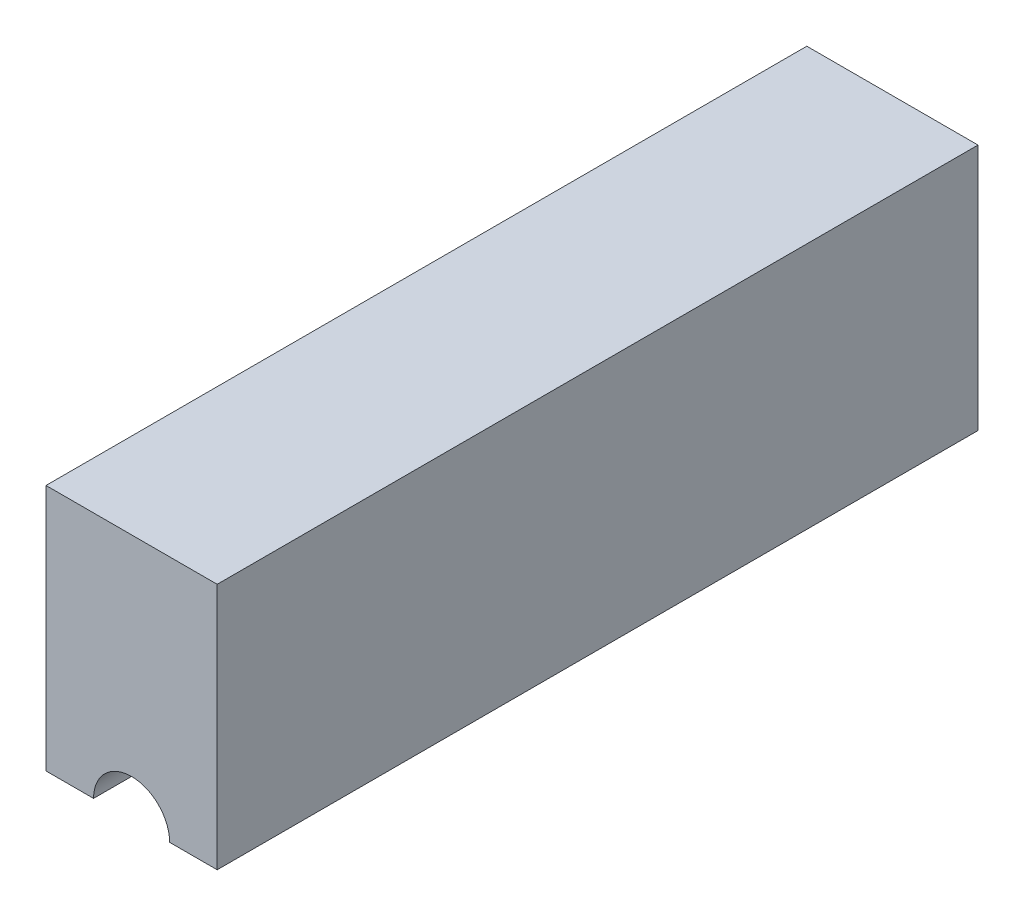
ISO-10303-21;
HEADER;
FILE_DESCRIPTION(('STEP AP214'),'2;1');
FILE_NAME('part.step','',(''),(''),'','','');
FILE_SCHEMA(('AUTOMOTIVE_DESIGN { 1 0 10303 214 1 1 1 1 }'));
ENDSEC;
DATA;
#1=APPLICATION_CONTEXT('core data for automotive mechanical design processes');
#2=APPLICATION_PROTOCOL_DEFINITION('international standard','automotive_design',2000,#1);
#3=PRODUCT_CONTEXT('',#1,'mechanical');
#4=PRODUCT('Part','Part','',(#3));
#5=PRODUCT_RELATED_PRODUCT_CATEGORY('part','',(#4));
#6=PRODUCT_DEFINITION_FORMATION('','',#4);
#7=PRODUCT_DEFINITION_CONTEXT('part definition',#1,'design');
#8=PRODUCT_DEFINITION('design','',#6,#7);
#9=PRODUCT_DEFINITION_SHAPE('','',#8);
#10=(LENGTH_UNIT() NAMED_UNIT(*) SI_UNIT(.MILLI.,.METRE.));
#11=(NAMED_UNIT(*) PLANE_ANGLE_UNIT() SI_UNIT($,.RADIAN.));
#12=(NAMED_UNIT(*) SI_UNIT($,.STERADIAN.) SOLID_ANGLE_UNIT());
#13=UNCERTAINTY_MEASURE_WITH_UNIT(LENGTH_MEASURE(1.E-05),#10,'distance_accuracy_value','');
#14=(GEOMETRIC_REPRESENTATION_CONTEXT(3) GLOBAL_UNCERTAINTY_ASSIGNED_CONTEXT((#13)) GLOBAL_UNIT_ASSIGNED_CONTEXT((#10,
#11,#12)) REPRESENTATION_CONTEXT('',''));
#15=CARTESIAN_POINT('',(0.,0.,0.));
#16=DIRECTION('',(0.,0.,1.));
#17=DIRECTION('',(1.,0.,0.));
#18=AXIS2_PLACEMENT_3D('',#15,#16,#17);
#19=CARTESIAN_POINT('',(0.,0.,100.));
#20=DIRECTION('',(1.,0.,0.));
#21=DIRECTION('',(0.,0.,-1.));
#22=AXIS2_PLACEMENT_3D('',#19,#20,#21);
#23=PLANE('',#22);
#24=DIRECTION('',(0.,-1.,0.));
#25=VECTOR('',#24,1.);
#26=CARTESIAN_POINT('',(0.,0.,-100.));
#27=LINE('',#26,#25);
#28=CARTESIAN_POINT('',(0.,65.,-100.));
#29=VERTEX_POINT('',#28);
#30=CARTESIAN_POINT('',(0.,0.,-100.));
#31=VERTEX_POINT('',#30);
#32=EDGE_CURVE('E94',#29,#31,#27,.T.);
#33=ORIENTED_EDGE('',*,*,#32,.T.);
#34=DIRECTION('',(0.,0.,-1.));
#35=VECTOR('',#34,1.);
#36=CARTESIAN_POINT('',(0.,0.,100.));
#37=LINE('',#36,#35);
#38=CARTESIAN_POINT('',(0.,0.,100.));
#39=VERTEX_POINT('',#38);
#40=EDGE_CURVE('E11',#39,#31,#37,.T.);
#41=ORIENTED_EDGE('',*,*,#40,.F.);
#42=DIRECTION('',(0.,-1.,0.));
#43=VECTOR('',#42,1.);
#44=CARTESIAN_POINT('',(0.,0.,100.));
#45=LINE('',#44,#43);
#46=CARTESIAN_POINT('',(0.,65.,100.));
#47=VERTEX_POINT('',#46);
#48=EDGE_CURVE('E117',#47,#39,#45,.T.);
#49=ORIENTED_EDGE('',*,*,#48,.F.);
#50=DIRECTION('',(0.,0.,-1.));
#51=VECTOR('',#50,1.);
#52=CARTESIAN_POINT('',(0.,65.,100.));
#53=LINE('',#52,#51);
#54=EDGE_CURVE('E107',#47,#29,#53,.T.);
#55=ORIENTED_EDGE('',*,*,#54,.T.);
#56=EDGE_LOOP('',(#33,#41,#49,#55));
#57=FACE_BOUND('',#56,.T.);
#58=ADVANCED_FACE('F38',(#57),#23,.F.);
#59=CARTESIAN_POINT('',(0.,0.,100.));
#60=DIRECTION('',(0.,1.,0.));
#61=DIRECTION('',(0.,0.,1.));
#62=AXIS2_PLACEMENT_3D('',#59,#60,#61);
#63=PLANE('',#62);
#64=DIRECTION('',(1.,0.,0.));
#65=VECTOR('',#64,1.);
#66=CARTESIAN_POINT('',(0.,0.,-100.));
#67=LINE('',#66,#65);
#68=CARTESIAN_POINT('',(12.5,0.,-100.));
#69=VERTEX_POINT('',#68);
#70=EDGE_CURVE('E90',#31,#69,#67,.T.);
#71=ORIENTED_EDGE('',*,*,#70,.T.);
#72=DIRECTION('',(0.,0.,-1.));
#73=VECTOR('',#72,1.);
#74=CARTESIAN_POINT('',(12.5,0.,100.));
#75=LINE('',#74,#73);
#76=CARTESIAN_POINT('',(12.5,0.,100.));
#77=VERTEX_POINT('',#76);
#78=EDGE_CURVE('E45',#77,#69,#75,.T.);
#79=ORIENTED_EDGE('',*,*,#78,.F.);
#80=DIRECTION('',(1.,0.,0.));
#81=VECTOR('',#80,1.);
#82=CARTESIAN_POINT('',(0.,0.,100.));
#83=LINE('',#82,#81);
#84=EDGE_CURVE('E103',#39,#77,#83,.T.);
#85=ORIENTED_EDGE('',*,*,#84,.F.);
#86=ORIENTED_EDGE('',*,*,#40,.T.);
#87=EDGE_LOOP('',(#71,#79,#85,#86));
#88=FACE_BOUND('',#87,.T.);
#89=ADVANCED_FACE('F102',(#88),#63,.F.);
#90=CARTESIAN_POINT('',(22.5,0.,100.));
#91=DIRECTION('',(0.,0.,-1.));
#92=DIRECTION('',(-1.,0.,0.));
#93=AXIS2_PLACEMENT_3D('',#90,#91,#92);
#94=CYLINDRICAL_SURFACE('',#93,10.);
#95=CARTESIAN_POINT('',(22.5,0.,-100.));
#96=DIRECTION('',(0.,0.,-1.));
#97=DIRECTION('',(1.,0.,0.));
#98=AXIS2_PLACEMENT_3D('',#95,#96,#97);
#99=CIRCLE('',#98,10.);
#100=CARTESIAN_POINT('',(32.5,0.,-100.));
#101=VERTEX_POINT('',#100);
#102=EDGE_CURVE('E96',#69,#101,#99,.T.);
#103=ORIENTED_EDGE('',*,*,#102,.T.);
#104=DIRECTION('',(0.,0.,-1.));
#105=VECTOR('',#104,1.);
#106=CARTESIAN_POINT('',(32.5,0.,100.));
#107=LINE('',#106,#105);
#108=CARTESIAN_POINT('',(32.5,0.,100.));
#109=VERTEX_POINT('',#108);
#110=EDGE_CURVE('E133',#109,#101,#107,.T.);
#111=ORIENTED_EDGE('',*,*,#110,.F.);
#112=CARTESIAN_POINT('',(22.5,0.,100.));
#113=DIRECTION('',(0.,0.,-1.));
#114=DIRECTION('',(1.,0.,0.));
#115=AXIS2_PLACEMENT_3D('',#112,#113,#114);
#116=CIRCLE('',#115,10.);
#117=EDGE_CURVE('E120',#77,#109,#116,.T.);
#118=ORIENTED_EDGE('',*,*,#117,.F.);
#119=ORIENTED_EDGE('',*,*,#78,.T.);
#120=EDGE_LOOP('',(#103,#111,#118,#119));
#121=FACE_BOUND('',#120,.T.);
#122=ADVANCED_FACE('F137',(#121),#94,.F.);
#123=CARTESIAN_POINT('',(32.5,0.,100.));
#124=DIRECTION('',(0.,1.,0.));
#125=DIRECTION('',(0.,0.,1.));
#126=AXIS2_PLACEMENT_3D('',#123,#124,#125);
#127=PLANE('',#126);
#128=DIRECTION('',(1.,0.,0.));
#129=VECTOR('',#128,1.);
#130=CARTESIAN_POINT('',(32.5,0.,-100.));
#131=LINE('',#130,#129);
#132=CARTESIAN_POINT('',(45.,0.,-100.));
#133=VERTEX_POINT('',#132);
#134=EDGE_CURVE('E111',#101,#133,#131,.T.);
#135=ORIENTED_EDGE('',*,*,#134,.T.);
#136=DIRECTION('',(0.,0.,-1.));
#137=VECTOR('',#136,1.);
#138=CARTESIAN_POINT('',(45.,0.,100.));
#139=LINE('',#138,#137);
#140=CARTESIAN_POINT('',(45.,0.,100.));
#141=VERTEX_POINT('',#140);
#142=EDGE_CURVE('E130',#141,#133,#139,.T.);
#143=ORIENTED_EDGE('',*,*,#142,.F.);
#144=DIRECTION('',(1.,0.,0.));
#145=VECTOR('',#144,1.);
#146=CARTESIAN_POINT('',(32.5,0.,100.));
#147=LINE('',#146,#145);
#148=EDGE_CURVE('E122',#109,#141,#147,.T.);
#149=ORIENTED_EDGE('',*,*,#148,.F.);
#150=ORIENTED_EDGE('',*,*,#110,.T.);
#151=EDGE_LOOP('',(#135,#143,#149,#150));
#152=FACE_BOUND('',#151,.T.);
#153=ADVANCED_FACE('F143',(#152),#127,.F.);
#154=CARTESIAN_POINT('',(45.,0.,100.));
#155=DIRECTION('',(-1.,0.,0.));
#156=DIRECTION('',(0.,0.,1.));
#157=AXIS2_PLACEMENT_3D('',#154,#155,#156);
#158=PLANE('',#157);
#159=DIRECTION('',(0.,1.,0.));
#160=VECTOR('',#159,1.);
#161=CARTESIAN_POINT('',(45.,0.,-100.));
#162=LINE('',#161,#160);
#163=CARTESIAN_POINT('',(45.,65.,-100.));
#164=VERTEX_POINT('',#163);
#165=EDGE_CURVE('E113',#133,#164,#162,.T.);
#166=ORIENTED_EDGE('',*,*,#165,.T.);
#167=DIRECTION('',(0.,0.,-1.));
#168=VECTOR('',#167,1.);
#169=CARTESIAN_POINT('',(45.,65.,100.));
#170=LINE('',#169,#168);
#171=CARTESIAN_POINT('',(45.,65.,100.));
#172=VERTEX_POINT('',#171);
#173=EDGE_CURVE('E127',#172,#164,#170,.T.);
#174=ORIENTED_EDGE('',*,*,#173,.F.);
#175=DIRECTION('',(0.,1.,0.));
#176=VECTOR('',#175,1.);
#177=CARTESIAN_POINT('',(45.,0.,100.));
#178=LINE('',#177,#176);
#179=EDGE_CURVE('E57',#141,#172,#178,.T.);
#180=ORIENTED_EDGE('',*,*,#179,.F.);
#181=ORIENTED_EDGE('',*,*,#142,.T.);
#182=EDGE_LOOP('',(#166,#174,#180,#181));
#183=FACE_BOUND('',#182,.T.);
#184=ADVANCED_FACE('F146',(#183),#158,.F.);
#185=CARTESIAN_POINT('',(0.,65.,100.));
#186=DIRECTION('',(0.,-1.,0.));
#187=DIRECTION('',(0.,0.,-1.));
#188=AXIS2_PLACEMENT_3D('',#185,#186,#187);
#189=PLANE('',#188);
#190=DIRECTION('',(-1.,0.,0.));
#191=VECTOR('',#190,1.);
#192=CARTESIAN_POINT('',(0.,65.,-100.));
#193=LINE('',#192,#191);
#194=EDGE_CURVE('E115',#164,#29,#193,.T.);
#195=ORIENTED_EDGE('',*,*,#194,.T.);
#196=ORIENTED_EDGE('',*,*,#54,.F.);
#197=DIRECTION('',(-1.,0.,0.));
#198=VECTOR('',#197,1.);
#199=CARTESIAN_POINT('',(0.,65.,100.));
#200=LINE('',#199,#198);
#201=EDGE_CURVE('E52',#172,#47,#200,.T.);
#202=ORIENTED_EDGE('',*,*,#201,.F.);
#203=ORIENTED_EDGE('',*,*,#173,.T.);
#204=EDGE_LOOP('',(#195,#196,#202,#203));
#205=FACE_BOUND('',#204,.T.);
#206=ADVANCED_FACE('F148',(#205),#189,.F.);
#207=CARTESIAN_POINT('',(22.5,0.,100.));
#208=DIRECTION('',(0.,0.,1.));
#209=DIRECTION('',(1.,0.,0.));
#210=AXIS2_PLACEMENT_3D('',#207,#208,#209);
#211=PLANE('',#210);
#212=ORIENTED_EDGE('',*,*,#48,.T.);
#213=ORIENTED_EDGE('',*,*,#84,.T.);
#214=ORIENTED_EDGE('',*,*,#117,.T.);
#215=ORIENTED_EDGE('',*,*,#148,.T.);
#216=ORIENTED_EDGE('',*,*,#179,.T.);
#217=ORIENTED_EDGE('',*,*,#201,.T.);
#218=EDGE_LOOP('',(#212,#213,#214,#215,#216,#217));
#219=FACE_BOUND('',#218,.T.);
#220=ADVANCED_FACE('F140',(#219),#211,.T.);
#221=CARTESIAN_POINT('',(22.5,0.,-100.));
#222=DIRECTION('',(0.,0.,1.));
#223=DIRECTION('',(1.,0.,0.));
#224=AXIS2_PLACEMENT_3D('',#221,#222,#223);
#225=PLANE('',#224);
#226=ORIENTED_EDGE('',*,*,#32,.F.);
#227=ORIENTED_EDGE('',*,*,#194,.F.);
#228=ORIENTED_EDGE('',*,*,#165,.F.);
#229=ORIENTED_EDGE('',*,*,#134,.F.);
#230=ORIENTED_EDGE('',*,*,#102,.F.);
#231=ORIENTED_EDGE('',*,*,#70,.F.);
#232=EDGE_LOOP('',(#226,#227,#228,#229,#230,#231));
#233=FACE_BOUND('',#232,.T.);
#234=ADVANCED_FACE('F91',(#233),#225,.F.);
#235=CLOSED_SHELL('',(#58,#89,#122,#153,#184,#206,#220,#234));
#236=MANIFOLD_SOLID_BREP('B2',#235);
#237=ADVANCED_BREP_SHAPE_REPRESENTATION('',(#18,#236),#14);
#238=SHAPE_DEFINITION_REPRESENTATION(#9,#237);
ENDSEC;
END-ISO-10303-21;
